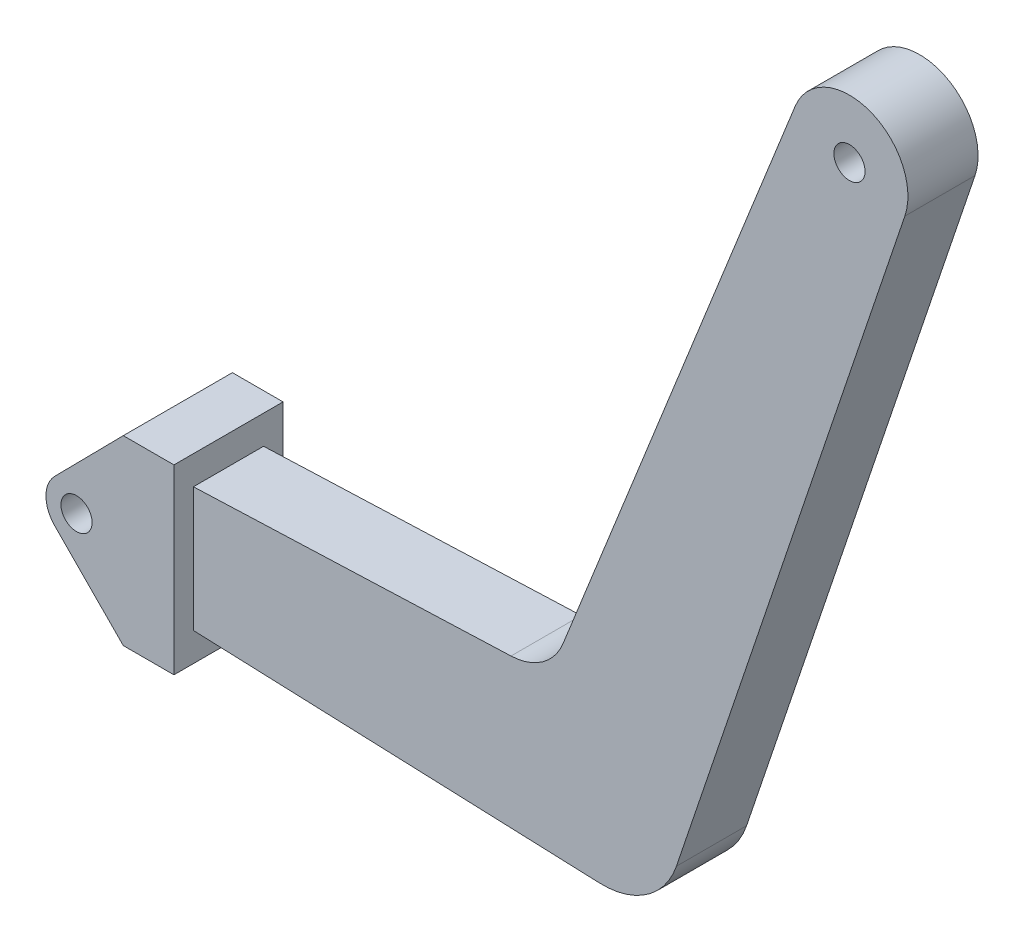
ISO-10303-21;
HEADER;
FILE_DESCRIPTION(('STEP AP214'),'2;1');
FILE_NAME('part.step','',(''),(''),'','','');
FILE_SCHEMA(('AUTOMOTIVE_DESIGN { 1 0 10303 214 1 1 1 1 }'));
ENDSEC;
DATA;
#1=APPLICATION_CONTEXT('core data for automotive mechanical design processes');
#2=APPLICATION_PROTOCOL_DEFINITION('international standard','automotive_design',2000,#1);
#3=PRODUCT_CONTEXT('',#1,'mechanical');
#4=PRODUCT('Part','Part','',(#3));
#5=PRODUCT_RELATED_PRODUCT_CATEGORY('part','',(#4));
#6=PRODUCT_DEFINITION_FORMATION('','',#4);
#7=PRODUCT_DEFINITION_CONTEXT('part definition',#1,'design');
#8=PRODUCT_DEFINITION('design','',#6,#7);
#9=PRODUCT_DEFINITION_SHAPE('','',#8);
#10=(LENGTH_UNIT() NAMED_UNIT(*) SI_UNIT(.MILLI.,.METRE.));
#11=(NAMED_UNIT(*) PLANE_ANGLE_UNIT() SI_UNIT($,.RADIAN.));
#12=(NAMED_UNIT(*) SI_UNIT($,.STERADIAN.) SOLID_ANGLE_UNIT());
#13=UNCERTAINTY_MEASURE_WITH_UNIT(LENGTH_MEASURE(1.E-05),#10,'distance_accuracy_value','');
#14=(GEOMETRIC_REPRESENTATION_CONTEXT(3) GLOBAL_UNCERTAINTY_ASSIGNED_CONTEXT((#13)) GLOBAL_UNIT_ASSIGNED_CONTEXT((#10,
#11,#12)) REPRESENTATION_CONTEXT('',''));
#15=CARTESIAN_POINT('',(0.,0.,0.));
#16=DIRECTION('',(0.,0.,1.));
#17=DIRECTION('',(1.,0.,0.));
#18=AXIS2_PLACEMENT_3D('',#15,#16,#17);
#19=CARTESIAN_POINT('',(-130.,0.,-40.));
#20=DIRECTION('',(0.,0.,1.));
#21=DIRECTION('',(1.,0.,0.));
#22=AXIS2_PLACEMENT_3D('',#19,#20,#21);
#23=CYLINDRICAL_SURFACE('',#22,3.99999999999999);
#24=CARTESIAN_POINT('',(-130.,0.,17.));
#25=DIRECTION('',(0.,0.,1.));
#26=DIRECTION('',(1.,0.,0.));
#27=AXIS2_PLACEMENT_3D('',#24,#25,#26);
#28=CIRCLE('',#27,3.99999999999999);
#29=CARTESIAN_POINT('',(-126.,0.,17.));
#30=VERTEX_POINT('',#29);
#31=EDGE_CURVE('E170',#30,#30,#28,.F.);
#32=ORIENTED_EDGE('',*,*,#31,.T.);
#33=EDGE_LOOP('',(#32));
#34=FACE_BOUND('',#33,.T.);
#35=CARTESIAN_POINT('',(-130.,0.,23.));
#36=DIRECTION('',(0.,0.,-1.));
#37=DIRECTION('',(0.,1.,0.));
#38=AXIS2_PLACEMENT_3D('',#35,#36,#37);
#39=CIRCLE('',#38,3.99999999999999);
#40=CARTESIAN_POINT('',(-130.,3.99999999999999,23.));
#41=VERTEX_POINT('',#40);
#42=EDGE_CURVE('E169',#41,#41,#39,.T.);
#43=ORIENTED_EDGE('',*,*,#42,.F.);
#44=EDGE_LOOP('',(#43));
#45=FACE_BOUND('',#44,.T.);
#46=ADVANCED_FACE('F41',(#34,#45),#23,.F.);
#47=CARTESIAN_POINT('',(-130.000001063068,-15.0000275579298,18.));
#48=DIRECTION('',(0.0385470818904149,0.999256785054639,0.));
#49=DIRECTION('',(-0.999256785054639,0.0385470818904149,0.));
#50=AXIS2_PLACEMENT_3D('',#47,#48,#49);
#51=PLANE('',#50);
#52=DIRECTION('',(0.,0.,1.));
#53=VECTOR('',#52,1.);
#54=CARTESIAN_POINT('',(-105.,-15.9644213980835,18.));
#55=LINE('',#54,#53);
#56=CARTESIAN_POINT('',(-105.,-15.9644213980835,0.));
#57=VERTEX_POINT('',#56);
#58=CARTESIAN_POINT('',(-105.,-15.9644213980835,18.));
#59=VERTEX_POINT('',#58);
#60=EDGE_CURVE('E283',#57,#59,#55,.T.);
#61=ORIENTED_EDGE('',*,*,#60,.F.);
#62=DIRECTION('',(0.999256785054639,-0.0385470818904149,0.));
#63=VECTOR('',#62,1.);
#64=CARTESIAN_POINT('',(-130.000001063068,-15.0000275579298,0.));
#65=LINE('',#64,#63);
#66=CARTESIAN_POINT('',(-0.770941637808299,-19.9851357010928,0.));
#67=VERTEX_POINT('',#66);
#68=EDGE_CURVE('E140',#57,#67,#65,.T.);
#69=ORIENTED_EDGE('',*,*,#68,.T.);
#70=DIRECTION('',(0.,0.,-1.));
#71=VECTOR('',#70,1.);
#72=CARTESIAN_POINT('',(-0.770941637808299,-19.9851357010928,18.));
#73=LINE('',#72,#71);
#74=CARTESIAN_POINT('',(-0.770941637808299,-19.9851357010928,18.));
#75=VERTEX_POINT('',#74);
#76=EDGE_CURVE('E160',#75,#67,#73,.T.);
#77=ORIENTED_EDGE('',*,*,#76,.F.);
#78=DIRECTION('',(0.999256785054639,-0.0385470818904149,0.));
#79=VECTOR('',#78,1.);
#80=CARTESIAN_POINT('',(-130.000001063068,-15.0000275579298,18.));
#81=LINE('',#80,#79);
#82=EDGE_CURVE('E100',#59,#75,#81,.T.);
#83=ORIENTED_EDGE('',*,*,#82,.F.);
#84=EDGE_LOOP('',(#61,#69,#77,#83));
#85=FACE_BOUND('',#84,.T.);
#86=ADVANCED_FACE('F43',(#85),#51,.F.);
#87=CARTESIAN_POINT('',(-130.576922015427,14.9889288794557,18.));
#88=DIRECTION('',(0.0384613261629484,-0.999260089461091,0.));
#89=DIRECTION('',(0.999260089461091,0.0384613261629484,0.));
#90=AXIS2_PLACEMENT_3D('',#87,#88,#89);
#91=PLANE('',#90);
#92=DIRECTION('',(0.,0.,-1.));
#93=VECTOR('',#92,1.);
#94=CARTESIAN_POINT('',(-105.,15.9733796248168,18.));
#95=LINE('',#94,#93);
#96=CARTESIAN_POINT('',(-105.,15.9733796248168,18.));
#97=VERTEX_POINT('',#96);
#98=CARTESIAN_POINT('',(-105.,15.9733796248168,0.));
#99=VERTEX_POINT('',#98);
#100=EDGE_CURVE('E280',#97,#99,#95,.T.);
#101=ORIENTED_EDGE('',*,*,#100,.F.);
#102=DIRECTION('',(-0.999260089461091,-0.0384613261629484,0.));
#103=VECTOR('',#102,1.);
#104=CARTESIAN_POINT('',(-130.576922015427,14.9889288794557,18.));
#105=LINE('',#104,#103);
#106=CARTESIAN_POINT('',(-23.4963010189174,19.1104411196763,18.));
#107=VERTEX_POINT('',#106);
#108=EDGE_CURVE('E134',#107,#97,#105,.T.);
#109=ORIENTED_EDGE('',*,*,#108,.F.);
#110=DIRECTION('',(0.,0.,-1.));
#111=VECTOR('',#110,1.);
#112=CARTESIAN_POINT('',(-23.4963010189174,19.1104411196763,18.));
#113=LINE('',#112,#111);
#114=CARTESIAN_POINT('',(-23.4963010189174,19.1104411196763,0.));
#115=VERTEX_POINT('',#114);
#116=EDGE_CURVE('E139',#107,#115,#113,.T.);
#117=ORIENTED_EDGE('',*,*,#116,.T.);
#118=DIRECTION('',(-0.999260089461091,-0.0384613261629484,0.));
#119=VECTOR('',#118,1.);
#120=CARTESIAN_POINT('',(-130.576922015427,14.9889288794557,0.));
#121=LINE('',#120,#119);
#122=EDGE_CURVE('E151',#115,#99,#121,.T.);
#123=ORIENTED_EDGE('',*,*,#122,.T.);
#124=EDGE_LOOP('',(#101,#109,#117,#123));
#125=FACE_BOUND('',#124,.T.);
#126=ADVANCED_FACE('F305',(#125),#91,.F.);
#127=CARTESIAN_POINT('',(-130.000001063068,0.,18.));
#128=DIRECTION('',(0.,0.,1.));
#129=DIRECTION('',(1.,0.,0.));
#130=AXIS2_PLACEMENT_3D('',#127,#128,#129);
#131=PLANE('',#130);
#132=CARTESIAN_POINT('',(63.364635234967,172.212580845708,18.));
#133=DIRECTION('',(0.,0.,1.));
#134=DIRECTION('',(1.,0.,0.));
#135=AXIS2_PLACEMENT_3D('',#132,#133,#134);
#136=CIRCLE('',#135,4.00000000000001);
#137=CARTESIAN_POINT('',(67.364635234967,172.212580845708,18.));
#138=VERTEX_POINT('',#137);
#139=EDGE_CURVE('E174',#138,#138,#136,.T.);
#140=ORIENTED_EDGE('',*,*,#139,.F.);
#141=EDGE_LOOP('',(#140));
#142=FACE_BOUND('',#141,.T.);
#143=ORIENTED_EDGE('',*,*,#108,.T.);
#144=DIRECTION('',(0.,-1.,0.));
#145=VECTOR('',#144,1.);
#146=CARTESIAN_POINT('',(-105.,0.,18.));
#147=LINE('',#146,#145);
#148=EDGE_CURVE('E143',#97,#59,#147,.T.);
#149=ORIENTED_EDGE('',*,*,#148,.T.);
#150=ORIENTED_EDGE('',*,*,#82,.T.);
#151=CARTESIAN_POINT('',(0.,0.,18.));
#152=DIRECTION('',(0.,0.,1.));
#153=DIRECTION('',(1.,0.,0.));
#154=AXIS2_PLACEMENT_3D('',#151,#152,#153);
#155=CIRCLE('',#154,20.);
#156=CARTESIAN_POINT('',(18.950963207853,-6.39226043701303,18.));
#157=VERTEX_POINT('',#156);
#158=EDGE_CURVE('E288',#75,#157,#155,.T.);
#159=ORIENTED_EDGE('',*,*,#158,.T.);
#160=DIRECTION('',(0.319613021850651,0.94754816039265,0.));
#161=VECTOR('',#160,1.);
#162=CARTESIAN_POINT('',(77.578179630942,167.418276908984,18.));
#163=LINE('',#162,#161);
#164=CARTESIAN_POINT('',(77.578179630942,167.418276908984,18.));
#165=VERTEX_POINT('',#164);
#166=EDGE_CURVE('E117',#157,#165,#163,.T.);
#167=ORIENTED_EDGE('',*,*,#166,.T.);
#168=CARTESIAN_POINT('',(63.364635234967,172.212580845708,18.));
#169=DIRECTION('',(0.,0.,1.));
#170=DIRECTION('',(1.,0.,0.));
#171=AXIS2_PLACEMENT_3D('',#168,#169,#170);
#172=CIRCLE('',#171,15.0003398139522);
#173=CARTESIAN_POINT('',(49.4333489187719,177.774006572105,18.));
#174=VERTEX_POINT('',#173);
#175=EDGE_CURVE('E110',#165,#174,#172,.T.);
#176=ORIENTED_EDGE('',*,*,#175,.T.);
#177=DIRECTION('',(-0.370753315949848,-0.92873138135426,0.));
#178=VECTOR('',#177,1.);
#179=CARTESIAN_POINT('',(49.4333489187719,177.774006572105,18.));
#180=LINE('',#179,#178);
#181=CARTESIAN_POINT('',(-10.1422501910476,28.538042722345,18.));
#182=VERTEX_POINT('',#181);
#183=EDGE_CURVE('E114',#174,#182,#180,.T.);
#184=ORIENTED_EDGE('',*,*,#183,.T.);
#185=CARTESIAN_POINT('',(-24.0732209113615,34.0993424615926,18.));
#186=DIRECTION('',(0.,0.,-1.));
#187=DIRECTION('',(-1.,0.,0.));
#188=AXIS2_PLACEMENT_3D('',#185,#186,#187);
#189=CIRCLE('',#188,15.);
#190=EDGE_CURVE('E65',#182,#107,#189,.T.);
#191=ORIENTED_EDGE('',*,*,#190,.T.);
#192=EDGE_LOOP('',(#143,#149,#150,#159,#167,#176,#184,#191));
#193=FACE_BOUND('',#192,.T.);
#194=ADVANCED_FACE('F112',(#142,#193),#131,.T.);
#195=CARTESIAN_POINT('',(-130.000001063068,0.,0.));
#196=DIRECTION('',(0.,0.,1.));
#197=DIRECTION('',(1.,0.,0.));
#198=AXIS2_PLACEMENT_3D('',#195,#196,#197);
#199=PLANE('',#198);
#200=CARTESIAN_POINT('',(63.364635234967,172.212580845708,0.));
#201=DIRECTION('',(0.,0.,1.));
#202=DIRECTION('',(1.,0.,0.));
#203=AXIS2_PLACEMENT_3D('',#200,#201,#202);
#204=CIRCLE('',#203,4.00000000000001);
#205=CARTESIAN_POINT('',(67.364635234967,172.212580845708,0.));
#206=VERTEX_POINT('',#205);
#207=EDGE_CURVE('E171',#206,#206,#204,.T.);
#208=ORIENTED_EDGE('',*,*,#207,.T.);
#209=EDGE_LOOP('',(#208));
#210=FACE_BOUND('',#209,.T.);
#211=DIRECTION('',(0.,-1.,0.));
#212=VECTOR('',#211,1.);
#213=CARTESIAN_POINT('',(-105.,0.,0.));
#214=LINE('',#213,#212);
#215=EDGE_CURVE('E163',#99,#57,#214,.T.);
#216=ORIENTED_EDGE('',*,*,#215,.F.);
#217=ORIENTED_EDGE('',*,*,#122,.F.);
#218=CARTESIAN_POINT('',(-24.0732209113615,34.0993424615926,0.));
#219=DIRECTION('',(0.,0.,-1.));
#220=DIRECTION('',(-1.,0.,0.));
#221=AXIS2_PLACEMENT_3D('',#218,#219,#220);
#222=CIRCLE('',#221,15.);
#223=CARTESIAN_POINT('',(-10.1422501910476,28.538042722345,0.));
#224=VERTEX_POINT('',#223);
#225=EDGE_CURVE('E92',#224,#115,#222,.T.);
#226=ORIENTED_EDGE('',*,*,#225,.F.);
#227=DIRECTION('',(-0.370753315949848,-0.92873138135426,0.));
#228=VECTOR('',#227,1.);
#229=CARTESIAN_POINT('',(49.4333489187719,177.774006572105,0.));
#230=LINE('',#229,#228);
#231=CARTESIAN_POINT('',(49.4333489187719,177.774006572105,0.));
#232=VERTEX_POINT('',#231);
#233=EDGE_CURVE('E148',#232,#224,#230,.T.);
#234=ORIENTED_EDGE('',*,*,#233,.F.);
#235=CARTESIAN_POINT('',(63.364635234967,172.212580845708,0.));
#236=DIRECTION('',(0.,0.,1.));
#237=DIRECTION('',(1.,0.,0.));
#238=AXIS2_PLACEMENT_3D('',#235,#236,#237);
#239=CIRCLE('',#238,15.0003398139522);
#240=CARTESIAN_POINT('',(77.578179630942,167.418276908984,0.));
#241=VERTEX_POINT('',#240);
#242=EDGE_CURVE('E126',#241,#232,#239,.T.);
#243=ORIENTED_EDGE('',*,*,#242,.F.);
#244=DIRECTION('',(0.319613021850651,0.94754816039265,0.));
#245=VECTOR('',#244,1.);
#246=CARTESIAN_POINT('',(77.578179630942,167.418276908984,0.));
#247=LINE('',#246,#245);
#248=CARTESIAN_POINT('',(18.950963207853,-6.39226043701303,0.));
#249=VERTEX_POINT('',#248);
#250=EDGE_CURVE('E145',#249,#241,#247,.T.);
#251=ORIENTED_EDGE('',*,*,#250,.F.);
#252=CARTESIAN_POINT('',(0.,0.,0.));
#253=DIRECTION('',(0.,0.,1.));
#254=DIRECTION('',(1.,0.,0.));
#255=AXIS2_PLACEMENT_3D('',#252,#253,#254);
#256=CIRCLE('',#255,20.);
#257=EDGE_CURVE('E142',#67,#249,#256,.T.);
#258=ORIENTED_EDGE('',*,*,#257,.F.);
#259=ORIENTED_EDGE('',*,*,#68,.F.);
#260=EDGE_LOOP('',(#216,#217,#226,#234,#243,#251,#258,#259));
#261=FACE_BOUND('',#260,.T.);
#262=ADVANCED_FACE('F299',(#210,#261),#199,.F.);
#263=CARTESIAN_POINT('',(0.,0.,18.));
#264=DIRECTION('',(0.,0.,-1.));
#265=DIRECTION('',(-1.,0.,0.));
#266=AXIS2_PLACEMENT_3D('',#263,#264,#265);
#267=CYLINDRICAL_SURFACE('',#266,20.);
#268=ORIENTED_EDGE('',*,*,#257,.T.);
#269=DIRECTION('',(0.,0.,-1.));
#270=VECTOR('',#269,1.);
#271=CARTESIAN_POINT('',(18.950963207853,-6.39226043701303,18.));
#272=LINE('',#271,#270);
#273=EDGE_CURVE('E157',#157,#249,#272,.T.);
#274=ORIENTED_EDGE('',*,*,#273,.F.);
#275=ORIENTED_EDGE('',*,*,#158,.F.);
#276=ORIENTED_EDGE('',*,*,#76,.T.);
#277=EDGE_LOOP('',(#268,#274,#275,#276));
#278=FACE_BOUND('',#277,.T.);
#279=ADVANCED_FACE('F292',(#278),#267,.T.);
#280=CARTESIAN_POINT('',(77.578179630942,167.418276908984,18.));
#281=DIRECTION('',(-0.94754816039265,0.319613021850651,0.));
#282=DIRECTION('',(-0.319613021850651,-0.94754816039265,0.));
#283=AXIS2_PLACEMENT_3D('',#280,#281,#282);
#284=PLANE('',#283);
#285=ORIENTED_EDGE('',*,*,#250,.T.);
#286=DIRECTION('',(0.,0.,-1.));
#287=VECTOR('',#286,1.);
#288=CARTESIAN_POINT('',(77.578179630942,167.418276908984,18.));
#289=LINE('',#288,#287);
#290=EDGE_CURVE('E129',#165,#241,#289,.T.);
#291=ORIENTED_EDGE('',*,*,#290,.F.);
#292=ORIENTED_EDGE('',*,*,#166,.F.);
#293=ORIENTED_EDGE('',*,*,#273,.T.);
#294=EDGE_LOOP('',(#285,#291,#292,#293));
#295=FACE_BOUND('',#294,.T.);
#296=ADVANCED_FACE('F296',(#295),#284,.F.);
#297=CARTESIAN_POINT('',(63.364635234967,172.212580845708,18.));
#298=DIRECTION('',(0.,0.,-1.));
#299=DIRECTION('',(-1.,0.,0.));
#300=AXIS2_PLACEMENT_3D('',#297,#298,#299);
#301=CYLINDRICAL_SURFACE('',#300,15.0003398139522);
#302=ORIENTED_EDGE('',*,*,#242,.T.);
#303=DIRECTION('',(0.,0.,-1.));
#304=VECTOR('',#303,1.);
#305=CARTESIAN_POINT('',(49.4333489187719,177.774006572105,18.));
#306=LINE('',#305,#304);
#307=EDGE_CURVE('E123',#174,#232,#306,.T.);
#308=ORIENTED_EDGE('',*,*,#307,.F.);
#309=ORIENTED_EDGE('',*,*,#175,.F.);
#310=ORIENTED_EDGE('',*,*,#290,.T.);
#311=EDGE_LOOP('',(#302,#308,#309,#310));
#312=FACE_BOUND('',#311,.T.);
#313=ADVANCED_FACE('F124',(#312),#301,.T.);
#314=CARTESIAN_POINT('',(49.4333489187719,177.774006572105,18.));
#315=DIRECTION('',(0.92873138135426,-0.370753315949848,0.));
#316=DIRECTION('',(0.370753315949848,0.92873138135426,0.));
#317=AXIS2_PLACEMENT_3D('',#314,#315,#316);
#318=PLANE('',#317);
#319=ORIENTED_EDGE('',*,*,#233,.T.);
#320=DIRECTION('',(0.,0.,-1.));
#321=VECTOR('',#320,1.);
#322=CARTESIAN_POINT('',(-10.1422501910476,28.538042722345,18.));
#323=LINE('',#322,#321);
#324=EDGE_CURVE('E130',#182,#224,#323,.T.);
#325=ORIENTED_EDGE('',*,*,#324,.F.);
#326=ORIENTED_EDGE('',*,*,#183,.F.);
#327=ORIENTED_EDGE('',*,*,#307,.T.);
#328=EDGE_LOOP('',(#319,#325,#326,#327));
#329=FACE_BOUND('',#328,.T.);
#330=ADVANCED_FACE('F132',(#329),#318,.F.);
#331=CARTESIAN_POINT('',(-24.0732209113615,34.0993424615926,18.));
#332=DIRECTION('',(0.,0.,-1.));
#333=DIRECTION('',(-1.,0.,0.));
#334=AXIS2_PLACEMENT_3D('',#331,#332,#333);
#335=CYLINDRICAL_SURFACE('',#334,15.);
#336=ORIENTED_EDGE('',*,*,#225,.T.);
#337=ORIENTED_EDGE('',*,*,#116,.F.);
#338=ORIENTED_EDGE('',*,*,#190,.F.);
#339=ORIENTED_EDGE('',*,*,#324,.T.);
#340=EDGE_LOOP('',(#336,#337,#338,#339));
#341=FACE_BOUND('',#340,.T.);
#342=ADVANCED_FACE('F301',(#341),#335,.F.);
#343=CARTESIAN_POINT('',(-105.,0.,0.));
#344=DIRECTION('',(-1.,0.,0.));
#345=DIRECTION('',(0.,0.,1.));
#346=AXIS2_PLACEMENT_3D('',#343,#344,#345);
#347=PLANE('',#346);
#348=DIRECTION('',(0.,1.,0.));
#349=VECTOR('',#348,1.);
#350=CARTESIAN_POINT('',(-105.,23.3378124467,23.));
#351=LINE('',#350,#349);
#352=CARTESIAN_POINT('',(-105.,-23.3288542199667,23.));
#353=VERTEX_POINT('',#352);
#354=CARTESIAN_POINT('',(-105.,23.3378124467,23.));
#355=VERTEX_POINT('',#354);
#356=EDGE_CURVE('E256',#353,#355,#351,.T.);
#357=ORIENTED_EDGE('',*,*,#356,.F.);
#358=DIRECTION('',(0.,0.,1.));
#359=VECTOR('',#358,1.);
#360=CARTESIAN_POINT('',(-105.,-23.3288542199667,-5.));
#361=LINE('',#360,#359);
#362=CARTESIAN_POINT('',(-105.,-23.3288542199667,-5.));
#363=VERTEX_POINT('',#362);
#364=EDGE_CURVE('E265',#363,#353,#361,.T.);
#365=ORIENTED_EDGE('',*,*,#364,.F.);
#366=DIRECTION('',(0.,-1.,0.));
#367=VECTOR('',#366,1.);
#368=CARTESIAN_POINT('',(-105.,23.3378124467,-5.));
#369=LINE('',#368,#367);
#370=CARTESIAN_POINT('',(-105.,23.3378124467,-5.));
#371=VERTEX_POINT('',#370);
#372=EDGE_CURVE('E262',#371,#363,#369,.T.);
#373=ORIENTED_EDGE('',*,*,#372,.F.);
#374=DIRECTION('',(0.,0.,-1.));
#375=VECTOR('',#374,1.);
#376=CARTESIAN_POINT('',(-105.,23.3378124467,-5.));
#377=LINE('',#376,#375);
#378=EDGE_CURVE('E259',#355,#371,#377,.T.);
#379=ORIENTED_EDGE('',*,*,#378,.F.);
#380=EDGE_LOOP('',(#357,#365,#373,#379));
#381=FACE_BOUND('',#380,.T.);
#382=ORIENTED_EDGE('',*,*,#148,.F.);
#383=ORIENTED_EDGE('',*,*,#100,.T.);
#384=ORIENTED_EDGE('',*,*,#215,.T.);
#385=ORIENTED_EDGE('',*,*,#60,.T.);
#386=EDGE_LOOP('',(#382,#383,#384,#385));
#387=FACE_BOUND('',#386,.T.);
#388=ADVANCED_FACE('F318',(#381,#387),#347,.F.);
#389=CARTESIAN_POINT('',(-140.,23.3378124467,23.));
#390=DIRECTION('',(0.,0.,-1.));
#391=DIRECTION('',(0.,1.,0.));
#392=AXIS2_PLACEMENT_3D('',#389,#390,#391);
#393=PLANE('',#392);
#394=ORIENTED_EDGE('',*,*,#42,.T.);
#395=EDGE_LOOP('',(#394));
#396=FACE_BOUND('',#395,.T.);
#397=CARTESIAN_POINT('',(-130.,0.,23.));
#398=DIRECTION('',(0.,0.,1.));
#399=DIRECTION('',(0.,1.,0.));
#400=AXIS2_PLACEMENT_3D('',#397,#398,#399);
#401=CIRCLE('',#400,7.84852896463162);
#402=CARTESIAN_POINT('',(-135.587008923928,5.51223531723874,23.));
#403=VERTEX_POINT('',#402);
#404=CARTESIAN_POINT('',(-135.587008923928,-5.51223531723866,23.));
#405=VERTEX_POINT('',#404);
#406=EDGE_CURVE('E413',#403,#405,#401,.T.);
#407=ORIENTED_EDGE('',*,*,#406,.T.);
#408=DIRECTION('',(0.702327193042012,-0.711854278566708,0.));
#409=VECTOR('',#408,1.);
#410=CARTESIAN_POINT('',(-118.,-23.3378124467002,23.));
#411=LINE('',#410,#409);
#412=CARTESIAN_POINT('',(-118.00883833451,-23.3288542199667,23.));
#413=VERTEX_POINT('',#412);
#414=EDGE_CURVE('E427',#405,#413,#411,.T.);
#415=ORIENTED_EDGE('',*,*,#414,.T.);
#416=DIRECTION('',(1.,0.,0.));
#417=VECTOR('',#416,1.);
#418=CARTESIAN_POINT('',(-140.,-23.3288542199667,23.));
#419=LINE('',#418,#417);
#420=EDGE_CURVE('E268',#413,#353,#419,.T.);
#421=ORIENTED_EDGE('',*,*,#420,.T.);
#422=ORIENTED_EDGE('',*,*,#356,.T.);
#423=DIRECTION('',(1.,0.,0.));
#424=VECTOR('',#423,1.);
#425=CARTESIAN_POINT('',(-140.,23.3378124467,23.));
#426=LINE('',#425,#424);
#427=CARTESIAN_POINT('',(-118.,23.3378124467,23.));
#428=VERTEX_POINT('',#427);
#429=EDGE_CURVE('E277',#428,#355,#426,.T.);
#430=ORIENTED_EDGE('',*,*,#429,.F.);
#431=DIRECTION('',(-0.702327193042022,-0.711854278566698,0.));
#432=VECTOR('',#431,1.);
#433=CARTESIAN_POINT('',(-118.,23.3378124467,23.));
#434=LINE('',#433,#432);
#435=EDGE_CURVE('E406',#428,#403,#434,.T.);
#436=ORIENTED_EDGE('',*,*,#435,.T.);
#437=EDGE_LOOP('',(#407,#415,#421,#422,#430,#436));
#438=FACE_BOUND('',#437,.T.);
#439=ADVANCED_FACE('F420',(#396,#438),#393,.F.);
#440=CARTESIAN_POINT('',(-140.,23.3378124467,-5.));
#441=DIRECTION('',(0.,-1.,0.));
#442=DIRECTION('',(0.,0.,-1.));
#443=AXIS2_PLACEMENT_3D('',#440,#441,#442);
#444=PLANE('',#443);
#445=DIRECTION('',(1.,0.,0.));
#446=VECTOR('',#445,1.);
#447=CARTESIAN_POINT('',(-140.,23.3378124467,-5.));
#448=LINE('',#447,#446);
#449=CARTESIAN_POINT('',(-118.,23.3378124467,-5.));
#450=VERTEX_POINT('',#449);
#451=EDGE_CURVE('E274',#450,#371,#448,.T.);
#452=ORIENTED_EDGE('',*,*,#451,.F.);
#453=DIRECTION('',(0.,0.,-1.));
#454=VECTOR('',#453,1.);
#455=CARTESIAN_POINT('',(-118.,23.3378124467,23.));
#456=LINE('',#455,#454);
#457=CARTESIAN_POINT('',(-118.,23.3378124467,1.));
#458=VERTEX_POINT('',#457);
#459=EDGE_CURVE('E221',#458,#450,#456,.T.);
#460=ORIENTED_EDGE('',*,*,#459,.F.);
#461=DIRECTION('',(0.,0.,-1.));
#462=VECTOR('',#461,1.);
#463=CARTESIAN_POINT('',(-118.,23.3378124467,17.));
#464=LINE('',#463,#462);
#465=CARTESIAN_POINT('',(-118.,23.3378124467,17.));
#466=VERTEX_POINT('',#465);
#467=EDGE_CURVE('E245',#466,#458,#464,.T.);
#468=ORIENTED_EDGE('',*,*,#467,.F.);
#469=EDGE_CURVE('E218',#428,#466,#456,.T.);
#470=ORIENTED_EDGE('',*,*,#469,.F.);
#471=ORIENTED_EDGE('',*,*,#429,.T.);
#472=ORIENTED_EDGE('',*,*,#378,.T.);
#473=EDGE_LOOP('',(#452,#460,#468,#470,#471,#472));
#474=FACE_BOUND('',#473,.T.);
#475=ADVANCED_FACE('F356',(#474),#444,.F.);
#476=CARTESIAN_POINT('',(-140.,23.3378124467,-5.));
#477=DIRECTION('',(0.,0.,1.));
#478=DIRECTION('',(0.,-1.,0.));
#479=AXIS2_PLACEMENT_3D('',#476,#477,#478);
#480=PLANE('',#479);
#481=CARTESIAN_POINT('',(-130.,0.,-5.));
#482=DIRECTION('',(0.,0.,1.));
#483=DIRECTION('',(0.,-1.,0.));
#484=AXIS2_PLACEMENT_3D('',#481,#482,#483);
#485=CIRCLE('',#484,3.99999999999999);
#486=CARTESIAN_POINT('',(-130.,-3.99999999999999,-5.));
#487=VERTEX_POINT('',#486);
#488=EDGE_CURVE('E166',#487,#487,#485,.T.);
#489=ORIENTED_EDGE('',*,*,#488,.T.);
#490=EDGE_LOOP('',(#489));
#491=FACE_BOUND('',#490,.T.);
#492=DIRECTION('',(1.,0.,0.));
#493=VECTOR('',#492,1.);
#494=CARTESIAN_POINT('',(-140.,-23.3288542199667,-5.));
#495=LINE('',#494,#493);
#496=CARTESIAN_POINT('',(-118.00883833451,-23.3288542199667,-5.));
#497=VERTEX_POINT('',#496);
#498=EDGE_CURVE('E271',#497,#363,#495,.T.);
#499=ORIENTED_EDGE('',*,*,#498,.F.);
#500=DIRECTION('',(0.702327193042012,-0.711854278566708,0.));
#501=VECTOR('',#500,1.);
#502=CARTESIAN_POINT('',(-118.,-23.3378124467002,-5.));
#503=LINE('',#502,#501);
#504=CARTESIAN_POINT('',(-135.587008923928,-5.51223531723866,-5.));
#505=VERTEX_POINT('',#504);
#506=EDGE_CURVE('E215',#505,#497,#503,.T.);
#507=ORIENTED_EDGE('',*,*,#506,.F.);
#508=CARTESIAN_POINT('',(-130.,0.,-5.));
#509=DIRECTION('',(0.,0.,1.));
#510=DIRECTION('',(0.,1.,0.));
#511=AXIS2_PLACEMENT_3D('',#508,#509,#510);
#512=CIRCLE('',#511,7.84852896463162);
#513=CARTESIAN_POINT('',(-135.587008923928,5.51223531723874,-5.));
#514=VERTEX_POINT('',#513);
#515=EDGE_CURVE('E204',#514,#505,#512,.T.);
#516=ORIENTED_EDGE('',*,*,#515,.F.);
#517=DIRECTION('',(-0.702327193042022,-0.711854278566698,0.));
#518=VECTOR('',#517,1.);
#519=CARTESIAN_POINT('',(-118.,23.3378124467,-5.));
#520=LINE('',#519,#518);
#521=EDGE_CURVE('E424',#450,#514,#520,.T.);
#522=ORIENTED_EDGE('',*,*,#521,.F.);
#523=ORIENTED_EDGE('',*,*,#451,.T.);
#524=ORIENTED_EDGE('',*,*,#372,.T.);
#525=EDGE_LOOP('',(#499,#507,#516,#522,#523,#524));
#526=FACE_BOUND('',#525,.T.);
#527=ADVANCED_FACE('F347',(#491,#526),#480,.F.);
#528=CARTESIAN_POINT('',(-140.,-23.3288542199667,-5.));
#529=DIRECTION('',(0.,1.,0.));
#530=DIRECTION('',(0.,0.,1.));
#531=AXIS2_PLACEMENT_3D('',#528,#529,#530);
#532=PLANE('',#531);
#533=ORIENTED_EDGE('',*,*,#420,.F.);
#534=DIRECTION('',(0.,0.,-1.));
#535=VECTOR('',#534,1.);
#536=CARTESIAN_POINT('',(-118.00883833451,-23.3288542199667,-5.));
#537=LINE('',#536,#535);
#538=CARTESIAN_POINT('',(-118.00883833451,-23.3288542199667,17.));
#539=VERTEX_POINT('',#538);
#540=EDGE_CURVE('E233',#413,#539,#537,.T.);
#541=ORIENTED_EDGE('',*,*,#540,.T.);
#542=DIRECTION('',(-1.,0.,0.));
#543=VECTOR('',#542,1.);
#544=CARTESIAN_POINT('',(-118.,-23.3288542199667,17.));
#545=LINE('',#544,#543);
#546=CARTESIAN_POINT('',(-118.,-23.3288542199667,17.));
#547=VERTEX_POINT('',#546);
#548=EDGE_CURVE('E178',#547,#539,#545,.T.);
#549=ORIENTED_EDGE('',*,*,#548,.F.);
#550=DIRECTION('',(0.,0.,1.));
#551=VECTOR('',#550,1.);
#552=CARTESIAN_POINT('',(-118.,-23.3288542199667,1.));
#553=LINE('',#552,#551);
#554=CARTESIAN_POINT('',(-118.,-23.3288542199667,1.));
#555=VERTEX_POINT('',#554);
#556=EDGE_CURVE('E239',#555,#547,#553,.T.);
#557=ORIENTED_EDGE('',*,*,#556,.F.);
#558=DIRECTION('',(-1.,0.,0.));
#559=VECTOR('',#558,1.);
#560=CARTESIAN_POINT('',(-118.,-23.3288542199667,1.));
#561=LINE('',#560,#559);
#562=CARTESIAN_POINT('',(-118.00883833451,-23.3288542199667,1.));
#563=VERTEX_POINT('',#562);
#564=EDGE_CURVE('E248',#555,#563,#561,.T.);
#565=ORIENTED_EDGE('',*,*,#564,.T.);
#566=EDGE_CURVE('E229',#563,#497,#537,.T.);
#567=ORIENTED_EDGE('',*,*,#566,.T.);
#568=ORIENTED_EDGE('',*,*,#498,.T.);
#569=ORIENTED_EDGE('',*,*,#364,.T.);
#570=EDGE_LOOP('',(#533,#541,#549,#557,#565,#567,#568,#569));
#571=FACE_BOUND('',#570,.T.);
#572=ADVANCED_FACE('F339',(#571),#532,.F.);
#573=CARTESIAN_POINT('',(-130.,0.,1.));
#574=DIRECTION('',(0.,0.,-1.));
#575=DIRECTION('',(-1.,0.,0.));
#576=AXIS2_PLACEMENT_3D('',#573,#574,#575);
#577=CIRCLE('',#576,3.99999999999999);
#578=CARTESIAN_POINT('',(-134.,0.,1.));
#579=VERTEX_POINT('',#578);
#580=EDGE_CURVE('E175',#579,#579,#577,.F.);
#581=ORIENTED_EDGE('',*,*,#580,.T.);
#582=EDGE_LOOP('',(#581));
#583=FACE_BOUND('',#582,.T.);
#584=ORIENTED_EDGE('',*,*,#488,.F.);
#585=EDGE_LOOP('',(#584));
#586=FACE_BOUND('',#585,.T.);
#587=ADVANCED_FACE('F330',(#583,#586),#23,.F.);
#588=CARTESIAN_POINT('',(63.364635234967,172.212580845708,-40.));
#589=DIRECTION('',(0.,0.,1.));
#590=DIRECTION('',(1.,0.,0.));
#591=AXIS2_PLACEMENT_3D('',#588,#589,#590);
#592=CYLINDRICAL_SURFACE('',#591,4.00000000000001);
#593=ORIENTED_EDGE('',*,*,#139,.T.);
#594=EDGE_LOOP('',(#593));
#595=FACE_BOUND('',#594,.T.);
#596=ORIENTED_EDGE('',*,*,#207,.F.);
#597=EDGE_LOOP('',(#596));
#598=FACE_BOUND('',#597,.T.);
#599=ADVANCED_FACE('F338',(#595,#598),#592,.F.);
#600=CARTESIAN_POINT('',(-118.,-23.3288542199667,17.));
#601=DIRECTION('',(0.,0.,1.));
#602=DIRECTION('',(1.,0.,0.));
#603=AXIS2_PLACEMENT_3D('',#600,#601,#602);
#604=PLANE('',#603);
#605=ORIENTED_EDGE('',*,*,#548,.T.);
#606=DIRECTION('',(-0.702327193042012,0.711854278566708,0.));
#607=VECTOR('',#606,1.);
#608=CARTESIAN_POINT('',(-118.004478706819,-23.3332729861146,17.));
#609=LINE('',#608,#607);
#610=CARTESIAN_POINT('',(-135.587008923928,-5.51223531723866,17.));
#611=VERTEX_POINT('',#610);
#612=EDGE_CURVE('E232',#539,#611,#609,.T.);
#613=ORIENTED_EDGE('',*,*,#612,.T.);
#614=CARTESIAN_POINT('',(-130.,0.,17.));
#615=DIRECTION('',(0.,0.,1.));
#616=DIRECTION('',(1.,0.,0.));
#617=AXIS2_PLACEMENT_3D('',#614,#615,#616);
#618=CIRCLE('',#617,7.84852896463162);
#619=CARTESIAN_POINT('',(-135.587008923928,5.51223531723874,17.));
#620=VERTEX_POINT('',#619);
#621=EDGE_CURVE('E226',#611,#620,#618,.F.);
#622=ORIENTED_EDGE('',*,*,#621,.T.);
#623=DIRECTION('',(0.702327193042022,0.711854278566698,0.));
#624=VECTOR('',#623,1.);
#625=CARTESIAN_POINT('',(-141.331215474966,-0.309891535940007,17.));
#626=LINE('',#625,#624);
#627=EDGE_CURVE('E223',#620,#466,#626,.T.);
#628=ORIENTED_EDGE('',*,*,#627,.T.);
#629=DIRECTION('',(0.,1.,0.));
#630=VECTOR('',#629,1.);
#631=CARTESIAN_POINT('',(-118.,-23.3288542199667,17.));
#632=LINE('',#631,#630);
#633=EDGE_CURVE('E242',#547,#466,#632,.T.);
#634=ORIENTED_EDGE('',*,*,#633,.F.);
#635=EDGE_LOOP('',(#605,#613,#622,#628,#634));
#636=FACE_BOUND('',#635,.T.);
#637=ORIENTED_EDGE('',*,*,#31,.F.);
#638=EDGE_LOOP('',(#637));
#639=FACE_BOUND('',#638,.T.);
#640=ADVANCED_FACE('F344',(#636,#639),#604,.F.);
#641=CARTESIAN_POINT('',(-118.,0.,1.));
#642=DIRECTION('',(0.,0.,-1.));
#643=DIRECTION('',(-1.,0.,0.));
#644=AXIS2_PLACEMENT_3D('',#641,#642,#643);
#645=PLANE('',#644);
#646=CARTESIAN_POINT('',(-130.,0.,1.));
#647=DIRECTION('',(0.,0.,-1.));
#648=DIRECTION('',(-1.,0.,0.));
#649=AXIS2_PLACEMENT_3D('',#646,#647,#648);
#650=CIRCLE('',#649,7.84852896463162);
#651=CARTESIAN_POINT('',(-135.587008923928,5.51223531723874,1.));
#652=VERTEX_POINT('',#651);
#653=CARTESIAN_POINT('',(-135.587008923928,-5.51223531723866,1.));
#654=VERTEX_POINT('',#653);
#655=EDGE_CURVE('E49',#652,#654,#650,.F.);
#656=ORIENTED_EDGE('',*,*,#655,.T.);
#657=DIRECTION('',(0.702327193042012,-0.711854278566708,0.));
#658=VECTOR('',#657,1.);
#659=CARTESIAN_POINT('',(-129.667847090893,-11.5116907250871,1.));
#660=LINE('',#659,#658);
#661=EDGE_CURVE('E11',#654,#563,#660,.T.);
#662=ORIENTED_EDGE('',*,*,#661,.T.);
#663=ORIENTED_EDGE('',*,*,#564,.F.);
#664=DIRECTION('',(0.,-1.,0.));
#665=VECTOR('',#664,1.);
#666=CARTESIAN_POINT('',(-118.,23.3378124467,1.));
#667=LINE('',#666,#665);
#668=EDGE_CURVE('E236',#458,#555,#667,.T.);
#669=ORIENTED_EDGE('',*,*,#668,.F.);
#670=DIRECTION('',(-0.702327193042022,-0.711854278566698,0.));
#671=VECTOR('',#670,1.);
#672=CARTESIAN_POINT('',(-129.667847090892,11.5116907250872,1.));
#673=LINE('',#672,#671);
#674=EDGE_CURVE('E191',#458,#652,#673,.T.);
#675=ORIENTED_EDGE('',*,*,#674,.T.);
#676=EDGE_LOOP('',(#656,#662,#663,#669,#675));
#677=FACE_BOUND('',#676,.T.);
#678=ORIENTED_EDGE('',*,*,#580,.F.);
#679=EDGE_LOOP('',(#678));
#680=FACE_BOUND('',#679,.T.);
#681=ADVANCED_FACE('F184',(#677,#680),#645,.F.);
#682=CARTESIAN_POINT('',(-118.,0.,0.));
#683=DIRECTION('',(-1.,0.,0.));
#684=DIRECTION('',(0.,0.,1.));
#685=AXIS2_PLACEMENT_3D('',#682,#683,#684);
#686=PLANE('',#685);
#687=ORIENTED_EDGE('',*,*,#668,.T.);
#688=ORIENTED_EDGE('',*,*,#556,.T.);
#689=ORIENTED_EDGE('',*,*,#633,.T.);
#690=ORIENTED_EDGE('',*,*,#467,.T.);
#691=EDGE_LOOP('',(#687,#688,#689,#690));
#692=FACE_BOUND('',#691,.T.);
#693=ADVANCED_FACE('F440',(#692),#686,.T.);
#694=CARTESIAN_POINT('',(-118.,23.3378124467,23.));
#695=DIRECTION('',(0.711854278566698,-0.702327193042022,0.));
#696=DIRECTION('',(0.702327193042022,0.711854278566698,0.));
#697=AXIS2_PLACEMENT_3D('',#694,#695,#696);
#698=PLANE('',#697);
#699=ORIENTED_EDGE('',*,*,#459,.T.);
#700=ORIENTED_EDGE('',*,*,#521,.T.);
#701=DIRECTION('',(0.,0.,-1.));
#702=VECTOR('',#701,1.);
#703=CARTESIAN_POINT('',(-135.587008923928,5.51223531723874,23.));
#704=LINE('',#703,#702);
#705=EDGE_CURVE('E56',#652,#514,#704,.T.);
#706=ORIENTED_EDGE('',*,*,#705,.F.);
#707=ORIENTED_EDGE('',*,*,#674,.F.);
#708=EDGE_LOOP('',(#699,#700,#706,#707));
#709=FACE_BOUND('',#708,.T.);
#710=ADVANCED_FACE('F442',(#709),#698,.F.);
#711=CARTESIAN_POINT('',(-130.,0.,23.));
#712=DIRECTION('',(0.,0.,-1.));
#713=DIRECTION('',(0.,1.,0.));
#714=AXIS2_PLACEMENT_3D('',#711,#712,#713);
#715=CYLINDRICAL_SURFACE('',#714,7.84852896463162);
#716=ORIENTED_EDGE('',*,*,#705,.T.);
#717=ORIENTED_EDGE('',*,*,#515,.T.);
#718=DIRECTION('',(0.,0.,-1.));
#719=VECTOR('',#718,1.);
#720=CARTESIAN_POINT('',(-135.587008923928,-5.51223531723866,23.));
#721=LINE('',#720,#719);
#722=EDGE_CURVE('E201',#654,#505,#721,.T.);
#723=ORIENTED_EDGE('',*,*,#722,.F.);
#724=ORIENTED_EDGE('',*,*,#655,.F.);
#725=EDGE_LOOP('',(#716,#717,#723,#724));
#726=FACE_BOUND('',#725,.T.);
#727=ADVANCED_FACE('F197',(#726),#715,.T.);
#728=CARTESIAN_POINT('',(-118.,-23.3378124467002,23.));
#729=DIRECTION('',(0.711854278566708,0.702327193042012,0.));
#730=DIRECTION('',(-0.702327193042012,0.711854278566708,0.));
#731=AXIS2_PLACEMENT_3D('',#728,#729,#730);
#732=PLANE('',#731);
#733=ORIENTED_EDGE('',*,*,#661,.F.);
#734=ORIENTED_EDGE('',*,*,#722,.T.);
#735=ORIENTED_EDGE('',*,*,#506,.T.);
#736=ORIENTED_EDGE('',*,*,#566,.F.);
#737=EDGE_LOOP('',(#733,#734,#735,#736));
#738=FACE_BOUND('',#737,.T.);
#739=ADVANCED_FACE('F485',(#738),#732,.F.);
#740=ORIENTED_EDGE('',*,*,#414,.F.);
#741=EDGE_CURVE('E208',#405,#611,#721,.T.);
#742=ORIENTED_EDGE('',*,*,#741,.T.);
#743=ORIENTED_EDGE('',*,*,#612,.F.);
#744=ORIENTED_EDGE('',*,*,#540,.F.);
#745=EDGE_LOOP('',(#740,#742,#743,#744));
#746=FACE_BOUND('',#745,.T.);
#747=ADVANCED_FACE('F433',(#746),#732,.F.);
#748=ORIENTED_EDGE('',*,*,#741,.F.);
#749=ORIENTED_EDGE('',*,*,#406,.F.);
#750=EDGE_CURVE('E209',#403,#620,#704,.T.);
#751=ORIENTED_EDGE('',*,*,#750,.T.);
#752=ORIENTED_EDGE('',*,*,#621,.F.);
#753=EDGE_LOOP('',(#748,#749,#751,#752));
#754=FACE_BOUND('',#753,.T.);
#755=ADVANCED_FACE('F431',(#754),#715,.T.);
#756=ORIENTED_EDGE('',*,*,#750,.F.);
#757=ORIENTED_EDGE('',*,*,#435,.F.);
#758=ORIENTED_EDGE('',*,*,#469,.T.);
#759=ORIENTED_EDGE('',*,*,#627,.F.);
#760=EDGE_LOOP('',(#756,#757,#758,#759));
#761=FACE_BOUND('',#760,.T.);
#762=ADVANCED_FACE('F408',(#761),#698,.F.);
#763=CLOSED_SHELL('',(#46,#86,#126,#194,#262,#279,#296,#313,#330,#342,#388,#439,#475,#527,#572,
#587,#599,#640,#681,#693,#710,#727,#739,#747,#755,#762));
#764=MANIFOLD_SOLID_BREP('B2',#763);
#765=ADVANCED_BREP_SHAPE_REPRESENTATION('',(#18,#764),#14);
#766=SHAPE_DEFINITION_REPRESENTATION(#9,#765);
ENDSEC;
END-ISO-10303-21;
